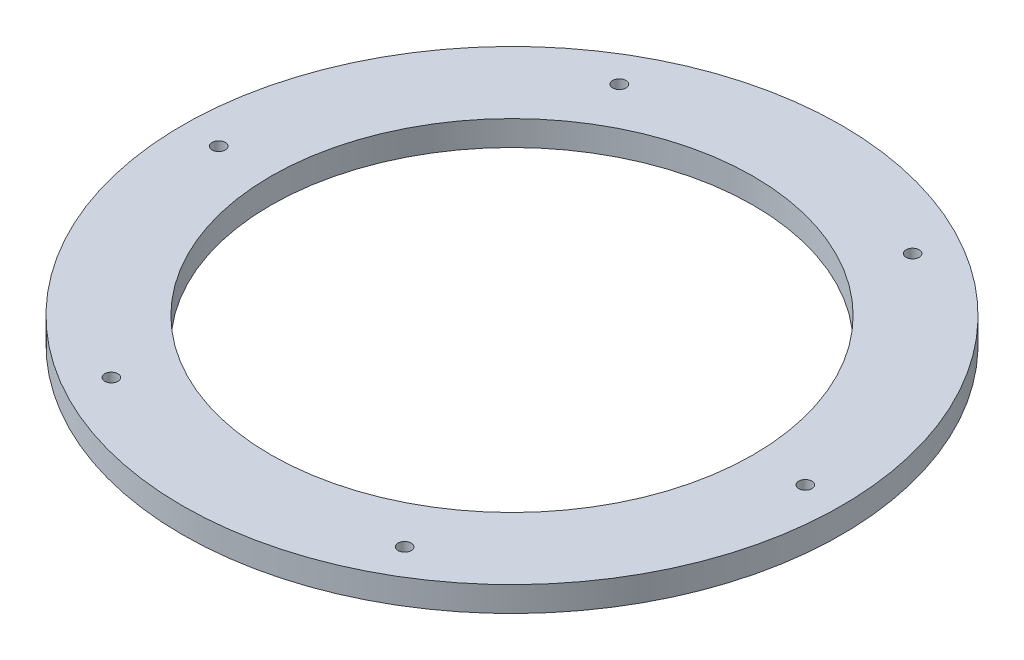
ISO-10303-21;
HEADER;
FILE_DESCRIPTION(('STEP AP214'),'2;1');
FILE_NAME('part.step','',(''),(''),'','','');
FILE_SCHEMA(('AUTOMOTIVE_DESIGN { 1 0 10303 214 1 1 1 1 }'));
ENDSEC;
DATA;
#1=APPLICATION_CONTEXT('core data for automotive mechanical design processes');
#2=APPLICATION_PROTOCOL_DEFINITION('international standard','automotive_design',2000,#1);
#3=PRODUCT_CONTEXT('',#1,'mechanical');
#4=PRODUCT('Part','Part','',(#3));
#5=PRODUCT_RELATED_PRODUCT_CATEGORY('part','',(#4));
#6=PRODUCT_DEFINITION_FORMATION('','',#4);
#7=PRODUCT_DEFINITION_CONTEXT('part definition',#1,'design');
#8=PRODUCT_DEFINITION('design','',#6,#7);
#9=PRODUCT_DEFINITION_SHAPE('','',#8);
#10=(LENGTH_UNIT() NAMED_UNIT(*) SI_UNIT(.MILLI.,.METRE.));
#11=(NAMED_UNIT(*) PLANE_ANGLE_UNIT() SI_UNIT($,.RADIAN.));
#12=(NAMED_UNIT(*) SI_UNIT($,.STERADIAN.) SOLID_ANGLE_UNIT());
#13=UNCERTAINTY_MEASURE_WITH_UNIT(LENGTH_MEASURE(1.E-05),#10,'distance_accuracy_value','');
#14=(GEOMETRIC_REPRESENTATION_CONTEXT(3) GLOBAL_UNCERTAINTY_ASSIGNED_CONTEXT((#13)) GLOBAL_UNIT_ASSIGNED_CONTEXT((#10,
#11,#12)) REPRESENTATION_CONTEXT('',''));
#15=CARTESIAN_POINT('',(0.,0.,0.));
#16=DIRECTION('',(0.,0.,1.));
#17=DIRECTION('',(1.,0.,0.));
#18=AXIS2_PLACEMENT_3D('',#15,#16,#17);
#19=CARTESIAN_POINT('',(0.,9.5,0.));
#20=DIRECTION('',(0.,1.,0.));
#21=DIRECTION('',(0.,0.,1.));
#22=AXIS2_PLACEMENT_3D('',#19,#20,#21);
#23=PLANE('',#22);
#24=CARTESIAN_POINT('',(111.25,9.5,192.690652342038));
#25=DIRECTION('',(0.,1.,0.));
#26=DIRECTION('',(0.,0.,-1.));
#27=AXIS2_PLACEMENT_3D('',#24,#25,#26);
#28=CIRCLE('',#27,5.00000000000001);
#29=CARTESIAN_POINT('',(111.25,9.5,187.690652342038));
#30=VERTEX_POINT('',#29);
#31=EDGE_CURVE('E84',#30,#30,#28,.T.);
#32=ORIENTED_EDGE('',*,*,#31,.F.);
#33=EDGE_LOOP('',(#32));
#34=FACE_BOUND('',#33,.T.);
#35=CARTESIAN_POINT('',(-222.5,9.5,1.55431223447522E-12));
#36=DIRECTION('',(0.,1.,0.));
#37=DIRECTION('',(0.,0.,-1.));
#38=AXIS2_PLACEMENT_3D('',#35,#36,#37);
#39=CIRCLE('',#38,4.99999999999992);
#40=CARTESIAN_POINT('',(-222.5,9.5,-4.99999999999837));
#41=VERTEX_POINT('',#40);
#42=EDGE_CURVE('E93',#41,#41,#39,.T.);
#43=ORIENTED_EDGE('',*,*,#42,.F.);
#44=EDGE_LOOP('',(#43));
#45=FACE_BOUND('',#44,.T.);
#46=CARTESIAN_POINT('',(-111.250000000001,9.5,-192.690652342037));
#47=DIRECTION('',(0.,1.,0.));
#48=DIRECTION('',(0.,0.,-1.));
#49=AXIS2_PLACEMENT_3D('',#46,#47,#48);
#50=CIRCLE('',#49,5.00000000000001);
#51=CARTESIAN_POINT('',(-111.250000000001,9.5,-197.690652342037));
#52=VERTEX_POINT('',#51);
#53=EDGE_CURVE('E68',#52,#52,#50,.T.);
#54=ORIENTED_EDGE('',*,*,#53,.F.);
#55=EDGE_LOOP('',(#54));
#56=FACE_BOUND('',#55,.T.);
#57=CARTESIAN_POINT('',(222.5,9.5,0.));
#58=DIRECTION('',(0.,1.,0.));
#59=DIRECTION('',(0.,0.,1.));
#60=AXIS2_PLACEMENT_3D('',#57,#58,#59);
#61=CIRCLE('',#60,4.99999999999999);
#62=CARTESIAN_POINT('',(222.5,9.5,4.99999999999999));
#63=VERTEX_POINT('',#62);
#64=EDGE_CURVE('E77',#63,#63,#61,.T.);
#65=ORIENTED_EDGE('',*,*,#64,.F.);
#66=EDGE_LOOP('',(#65));
#67=FACE_BOUND('',#66,.T.);
#68=CARTESIAN_POINT('',(-111.250000000001,9.5,192.690652342037));
#69=DIRECTION('',(0.,1.,0.));
#70=DIRECTION('',(0.,0.,1.));
#71=AXIS2_PLACEMENT_3D('',#68,#69,#70);
#72=CIRCLE('',#71,5.00000000000001);
#73=CARTESIAN_POINT('',(-111.250000000001,9.5,197.690652342037));
#74=VERTEX_POINT('',#73);
#75=EDGE_CURVE('E100',#74,#74,#72,.T.);
#76=ORIENTED_EDGE('',*,*,#75,.F.);
#77=EDGE_LOOP('',(#76));
#78=FACE_BOUND('',#77,.T.);
#79=CARTESIAN_POINT('',(111.25,9.5,-192.690652342038));
#80=DIRECTION('',(0.,1.,0.));
#81=DIRECTION('',(0.,0.,1.));
#82=AXIS2_PLACEMENT_3D('',#79,#80,#81);
#83=CIRCLE('',#82,5.00000000000001);
#84=CARTESIAN_POINT('',(111.25,9.5,-187.690652342038));
#85=VERTEX_POINT('',#84);
#86=EDGE_CURVE('E60',#85,#85,#83,.T.);
#87=ORIENTED_EDGE('',*,*,#86,.F.);
#88=EDGE_LOOP('',(#87));
#89=FACE_BOUND('',#88,.T.);
#90=CARTESIAN_POINT('',(0.,9.5,0.));
#91=DIRECTION('',(0.,1.,0.));
#92=DIRECTION('',(0.,0.,1.));
#93=AXIS2_PLACEMENT_3D('',#90,#91,#92);
#94=CIRCLE('',#93,250.);
#95=CARTESIAN_POINT('',(0.,9.5,250.));
#96=VERTEX_POINT('',#95);
#97=EDGE_CURVE('E10',#96,#96,#94,.T.);
#98=ORIENTED_EDGE('',*,*,#97,.T.);
#99=EDGE_LOOP('',(#98));
#100=FACE_BOUND('',#99,.T.);
#101=CARTESIAN_POINT('',(0.,9.5,0.));
#102=DIRECTION('',(0.,1.,0.));
#103=DIRECTION('',(0.,0.,1.));
#104=AXIS2_PLACEMENT_3D('',#101,#102,#103);
#105=CIRCLE('',#104,183.);
#106=CARTESIAN_POINT('',(0.,9.5,183.));
#107=VERTEX_POINT('',#106);
#108=EDGE_CURVE('E50',#107,#107,#105,.T.);
#109=ORIENTED_EDGE('',*,*,#108,.F.);
#110=EDGE_LOOP('',(#109));
#111=FACE_BOUND('',#110,.T.);
#112=ADVANCED_FACE('F36',(#34,#45,#56,#67,#78,#89,#100,#111),#23,.T.);
#113=CARTESIAN_POINT('',(0.,-9.5,0.));
#114=DIRECTION('',(0.,1.,0.));
#115=DIRECTION('',(0.,0.,1.));
#116=AXIS2_PLACEMENT_3D('',#113,#114,#115);
#117=PLANE('',#116);
#118=CARTESIAN_POINT('',(111.25,-9.5,192.690652342038));
#119=DIRECTION('',(0.,1.,0.));
#120=DIRECTION('',(0.,0.,-1.));
#121=AXIS2_PLACEMENT_3D('',#118,#119,#120);
#122=CIRCLE('',#121,5.00000000000001);
#123=CARTESIAN_POINT('',(111.25,-9.5,187.690652342038));
#124=VERTEX_POINT('',#123);
#125=EDGE_CURVE('E88',#124,#124,#122,.T.);
#126=ORIENTED_EDGE('',*,*,#125,.T.);
#127=EDGE_LOOP('',(#126));
#128=FACE_BOUND('',#127,.T.);
#129=CARTESIAN_POINT('',(-222.5,-9.5,1.55431223447522E-12));
#130=DIRECTION('',(0.,1.,0.));
#131=DIRECTION('',(0.,0.,-1.));
#132=AXIS2_PLACEMENT_3D('',#129,#130,#131);
#133=CIRCLE('',#132,4.99999999999992);
#134=CARTESIAN_POINT('',(-222.5,-9.5,-4.99999999999837));
#135=VERTEX_POINT('',#134);
#136=EDGE_CURVE('E73',#135,#135,#133,.T.);
#137=ORIENTED_EDGE('',*,*,#136,.T.);
#138=EDGE_LOOP('',(#137));
#139=FACE_BOUND('',#138,.T.);
#140=CARTESIAN_POINT('',(-111.250000000001,-9.5,-192.690652342037));
#141=DIRECTION('',(0.,1.,0.));
#142=DIRECTION('',(0.,0.,-1.));
#143=AXIS2_PLACEMENT_3D('',#140,#141,#142);
#144=CIRCLE('',#143,5.00000000000001);
#145=CARTESIAN_POINT('',(-111.250000000001,-9.5,-197.690652342037));
#146=VERTEX_POINT('',#145);
#147=EDGE_CURVE('E72',#146,#146,#144,.T.);
#148=ORIENTED_EDGE('',*,*,#147,.T.);
#149=EDGE_LOOP('',(#148));
#150=FACE_BOUND('',#149,.T.);
#151=CARTESIAN_POINT('',(222.5,-9.5,0.));
#152=DIRECTION('',(0.,1.,0.));
#153=DIRECTION('',(0.,0.,1.));
#154=AXIS2_PLACEMENT_3D('',#151,#152,#153);
#155=CIRCLE('',#154,4.99999999999999);
#156=CARTESIAN_POINT('',(222.5,-9.5,4.99999999999999));
#157=VERTEX_POINT('',#156);
#158=EDGE_CURVE('E64',#157,#157,#155,.T.);
#159=ORIENTED_EDGE('',*,*,#158,.T.);
#160=EDGE_LOOP('',(#159));
#161=FACE_BOUND('',#160,.T.);
#162=CARTESIAN_POINT('',(-111.250000000001,-9.5,192.690652342037));
#163=DIRECTION('',(0.,1.,0.));
#164=DIRECTION('',(0.,0.,1.));
#165=AXIS2_PLACEMENT_3D('',#162,#163,#164);
#166=CIRCLE('',#165,5.00000000000001);
#167=CARTESIAN_POINT('',(-111.250000000001,-9.5,197.690652342037));
#168=VERTEX_POINT('',#167);
#169=EDGE_CURVE('E89',#168,#168,#166,.T.);
#170=ORIENTED_EDGE('',*,*,#169,.T.);
#171=EDGE_LOOP('',(#170));
#172=FACE_BOUND('',#171,.T.);
#173=CARTESIAN_POINT('',(111.25,-9.5,-192.690652342038));
#174=DIRECTION('',(0.,1.,0.));
#175=DIRECTION('',(0.,0.,1.));
#176=AXIS2_PLACEMENT_3D('',#173,#174,#175);
#177=CIRCLE('',#176,5.00000000000001);
#178=CARTESIAN_POINT('',(111.25,-9.5,-187.690652342038));
#179=VERTEX_POINT('',#178);
#180=EDGE_CURVE('E56',#179,#179,#177,.T.);
#181=ORIENTED_EDGE('',*,*,#180,.T.);
#182=EDGE_LOOP('',(#181));
#183=FACE_BOUND('',#182,.T.);
#184=CARTESIAN_POINT('',(0.,-9.5,0.));
#185=DIRECTION('',(0.,1.,0.));
#186=DIRECTION('',(0.,0.,1.));
#187=AXIS2_PLACEMENT_3D('',#184,#185,#186);
#188=CIRCLE('',#187,250.);
#189=CARTESIAN_POINT('',(0.,-9.5,250.));
#190=VERTEX_POINT('',#189);
#191=EDGE_CURVE('E40',#190,#190,#188,.T.);
#192=ORIENTED_EDGE('',*,*,#191,.F.);
#193=EDGE_LOOP('',(#192));
#194=FACE_BOUND('',#193,.T.);
#195=CARTESIAN_POINT('',(0.,-9.5,0.));
#196=DIRECTION('',(0.,1.,0.));
#197=DIRECTION('',(0.,0.,1.));
#198=AXIS2_PLACEMENT_3D('',#195,#196,#197);
#199=CIRCLE('',#198,183.);
#200=CARTESIAN_POINT('',(0.,-9.5,183.));
#201=VERTEX_POINT('',#200);
#202=EDGE_CURVE('E52',#201,#201,#199,.T.);
#203=ORIENTED_EDGE('',*,*,#202,.T.);
#204=EDGE_LOOP('',(#203));
#205=FACE_BOUND('',#204,.T.);
#206=ADVANCED_FACE('F109',(#128,#139,#150,#161,#172,#183,#194,#205),#117,.F.);
#207=CARTESIAN_POINT('',(0.,9.5,0.));
#208=DIRECTION('',(0.,-1.,0.));
#209=DIRECTION('',(0.,0.,-1.));
#210=AXIS2_PLACEMENT_3D('',#207,#208,#209);
#211=CYLINDRICAL_SURFACE('',#210,250.);
#212=ORIENTED_EDGE('',*,*,#97,.F.);
#213=EDGE_LOOP('',(#212));
#214=FACE_BOUND('',#213,.T.);
#215=ORIENTED_EDGE('',*,*,#191,.T.);
#216=EDGE_LOOP('',(#215));
#217=FACE_BOUND('',#216,.T.);
#218=ADVANCED_FACE('F38',(#214,#217),#211,.T.);
#219=CARTESIAN_POINT('',(0.,9.5,0.));
#220=DIRECTION('',(0.,-1.,0.));
#221=DIRECTION('',(0.,0.,-1.));
#222=AXIS2_PLACEMENT_3D('',#219,#220,#221);
#223=CYLINDRICAL_SURFACE('',#222,183.);
#224=ORIENTED_EDGE('',*,*,#108,.T.);
#225=EDGE_LOOP('',(#224));
#226=FACE_BOUND('',#225,.T.);
#227=ORIENTED_EDGE('',*,*,#202,.F.);
#228=EDGE_LOOP('',(#227));
#229=FACE_BOUND('',#228,.T.);
#230=ADVANCED_FACE('F128',(#226,#229),#223,.F.);
#231=CARTESIAN_POINT('',(111.25,-9.5,-192.690652342038));
#232=DIRECTION('',(0.,1.,0.));
#233=DIRECTION('',(0.,0.,1.));
#234=AXIS2_PLACEMENT_3D('',#231,#232,#233);
#235=CYLINDRICAL_SURFACE('',#234,5.00000000000001);
#236=ORIENTED_EDGE('',*,*,#180,.F.);
#237=EDGE_LOOP('',(#236));
#238=FACE_BOUND('',#237,.T.);
#239=ORIENTED_EDGE('',*,*,#86,.T.);
#240=EDGE_LOOP('',(#239));
#241=FACE_BOUND('',#240,.T.);
#242=ADVANCED_FACE('F116',(#238,#241),#235,.F.);
#243=CARTESIAN_POINT('',(-111.250000000001,-9.5,192.690652342037));
#244=DIRECTION('',(0.,1.,0.));
#245=DIRECTION('',(0.,0.,1.));
#246=AXIS2_PLACEMENT_3D('',#243,#244,#245);
#247=CYLINDRICAL_SURFACE('',#246,5.00000000000001);
#248=ORIENTED_EDGE('',*,*,#169,.F.);
#249=EDGE_LOOP('',(#248));
#250=FACE_BOUND('',#249,.T.);
#251=ORIENTED_EDGE('',*,*,#75,.T.);
#252=EDGE_LOOP('',(#251));
#253=FACE_BOUND('',#252,.T.);
#254=ADVANCED_FACE('F112',(#250,#253),#247,.F.);
#255=CARTESIAN_POINT('',(222.5,-9.5,0.));
#256=DIRECTION('',(0.,1.,0.));
#257=DIRECTION('',(0.,0.,1.));
#258=AXIS2_PLACEMENT_3D('',#255,#256,#257);
#259=CYLINDRICAL_SURFACE('',#258,4.99999999999999);
#260=ORIENTED_EDGE('',*,*,#158,.F.);
#261=EDGE_LOOP('',(#260));
#262=FACE_BOUND('',#261,.T.);
#263=ORIENTED_EDGE('',*,*,#64,.T.);
#264=EDGE_LOOP('',(#263));
#265=FACE_BOUND('',#264,.T.);
#266=ADVANCED_FACE('F115',(#262,#265),#259,.F.);
#267=CARTESIAN_POINT('',(-111.250000000001,-9.5,-192.690652342037));
#268=DIRECTION('',(0.,1.,0.));
#269=DIRECTION('',(0.,0.,1.));
#270=AXIS2_PLACEMENT_3D('',#267,#268,#269);
#271=CYLINDRICAL_SURFACE('',#270,5.00000000000001);
#272=ORIENTED_EDGE('',*,*,#147,.F.);
#273=EDGE_LOOP('',(#272));
#274=FACE_BOUND('',#273,.T.);
#275=ORIENTED_EDGE('',*,*,#53,.T.);
#276=EDGE_LOOP('',(#275));
#277=FACE_BOUND('',#276,.T.);
#278=ADVANCED_FACE('F145',(#274,#277),#271,.F.);
#279=CARTESIAN_POINT('',(-222.5,-9.5,1.55431223447522E-12));
#280=DIRECTION('',(0.,1.,0.));
#281=DIRECTION('',(0.,0.,1.));
#282=AXIS2_PLACEMENT_3D('',#279,#280,#281);
#283=CYLINDRICAL_SURFACE('',#282,4.99999999999992);
#284=ORIENTED_EDGE('',*,*,#136,.F.);
#285=EDGE_LOOP('',(#284));
#286=FACE_BOUND('',#285,.T.);
#287=ORIENTED_EDGE('',*,*,#42,.T.);
#288=EDGE_LOOP('',(#287));
#289=FACE_BOUND('',#288,.T.);
#290=ADVANCED_FACE('F148',(#286,#289),#283,.F.);
#291=CARTESIAN_POINT('',(111.25,-9.5,192.690652342038));
#292=DIRECTION('',(0.,1.,0.));
#293=DIRECTION('',(0.,0.,1.));
#294=AXIS2_PLACEMENT_3D('',#291,#292,#293);
#295=CYLINDRICAL_SURFACE('',#294,5.00000000000001);
#296=ORIENTED_EDGE('',*,*,#125,.F.);
#297=EDGE_LOOP('',(#296));
#298=FACE_BOUND('',#297,.T.);
#299=ORIENTED_EDGE('',*,*,#31,.T.);
#300=EDGE_LOOP('',(#299));
#301=FACE_BOUND('',#300,.T.);
#302=ADVANCED_FACE('F153',(#298,#301),#295,.F.);
#303=CLOSED_SHELL('',(#112,#206,#218,#230,#242,#254,#266,#278,#290,#302));
#304=MANIFOLD_SOLID_BREP('B2',#303);
#305=ADVANCED_BREP_SHAPE_REPRESENTATION('',(#18,#304),#14);
#306=SHAPE_DEFINITION_REPRESENTATION(#9,#305);
ENDSEC;
END-ISO-10303-21;
